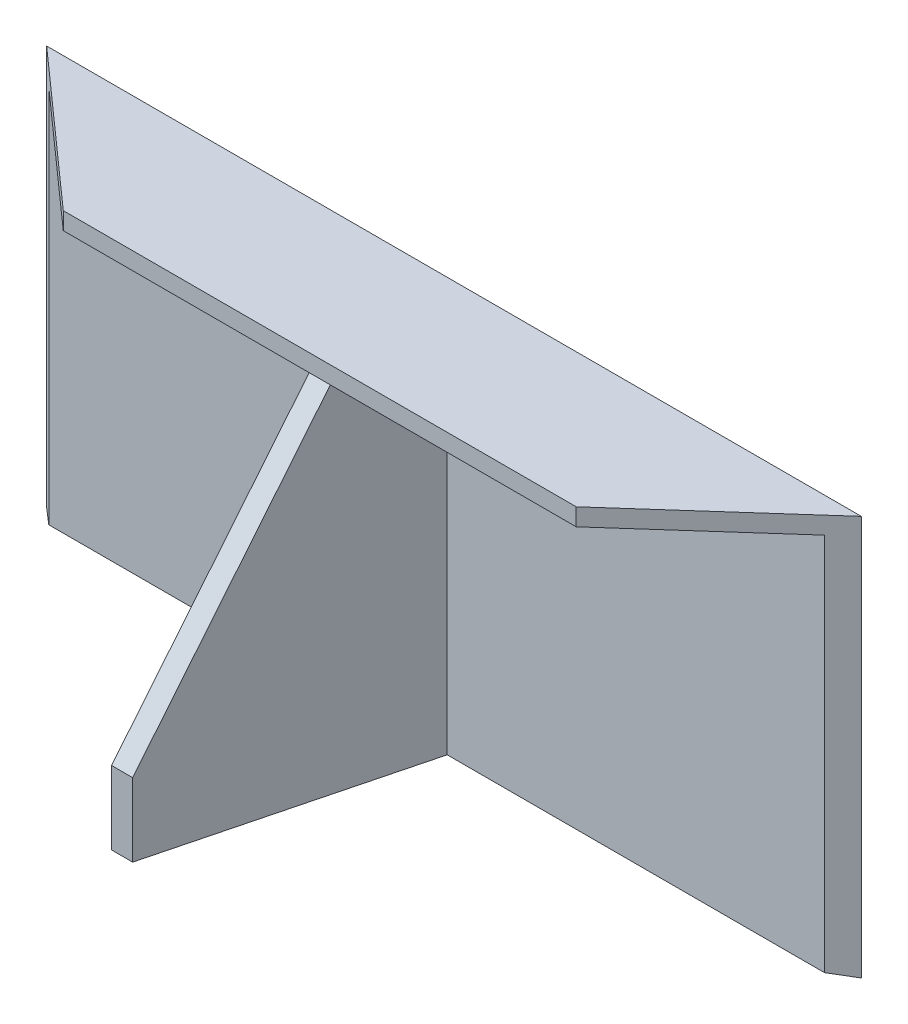
ISO-10303-21;
HEADER;
FILE_DESCRIPTION(('STEP AP214'),'2;1');
FILE_NAME('part.step','',(''),(''),'','','');
FILE_SCHEMA(('AUTOMOTIVE_DESIGN { 1 0 10303 214 1 1 1 1 }'));
ENDSEC;
DATA;
#1=APPLICATION_CONTEXT('core data for automotive mechanical design processes');
#2=APPLICATION_PROTOCOL_DEFINITION('international standard','automotive_design',2000,#1);
#3=PRODUCT_CONTEXT('',#1,'mechanical');
#4=PRODUCT('Part','Part','',(#3));
#5=PRODUCT_RELATED_PRODUCT_CATEGORY('part','',(#4));
#6=PRODUCT_DEFINITION_FORMATION('','',#4);
#7=PRODUCT_DEFINITION_CONTEXT('part definition',#1,'design');
#8=PRODUCT_DEFINITION('design','',#6,#7);
#9=PRODUCT_DEFINITION_SHAPE('','',#8);
#10=(LENGTH_UNIT() NAMED_UNIT(*) SI_UNIT(.MILLI.,.METRE.));
#11=(NAMED_UNIT(*) PLANE_ANGLE_UNIT() SI_UNIT($,.RADIAN.));
#12=(NAMED_UNIT(*) SI_UNIT($,.STERADIAN.) SOLID_ANGLE_UNIT());
#13=UNCERTAINTY_MEASURE_WITH_UNIT(LENGTH_MEASURE(1.E-05),#10,'distance_accuracy_value','');
#14=(GEOMETRIC_REPRESENTATION_CONTEXT(3) GLOBAL_UNCERTAINTY_ASSIGNED_CONTEXT((#13)) GLOBAL_UNIT_ASSIGNED_CONTEXT((#10,
#11,#12)) REPRESENTATION_CONTEXT('',''));
#15=CARTESIAN_POINT('',(0.,0.,0.));
#16=DIRECTION('',(0.,0.,1.));
#17=DIRECTION('',(1.,0.,0.));
#18=AXIS2_PLACEMENT_3D('',#15,#16,#17);
#19=CARTESIAN_POINT('',(0.,265.,11.5));
#20=DIRECTION('',(0.,0.,-1.));
#21=DIRECTION('',(-1.,0.,0.));
#22=AXIS2_PLACEMENT_3D('',#19,#20,#21);
#23=PLANE('',#22);
#24=DIRECTION('',(0.,-1.,0.));
#25=VECTOR('',#24,1.);
#26=CARTESIAN_POINT('',(12.9213483146067,265.,11.5));
#27=LINE('',#26,#25);
#28=CARTESIAN_POINT('',(12.9213483146067,253.5,11.5));
#29=VERTEX_POINT('',#28);
#30=CARTESIAN_POINT('',(12.9213483146067,2.35227272727279,11.5));
#31=VERTEX_POINT('',#30);
#32=EDGE_CURVE('E162',#29,#31,#27,.T.);
#33=ORIENTED_EDGE('',*,*,#32,.T.);
#34=DIRECTION('',(1.,0.,0.));
#35=VECTOR('',#34,1.);
#36=CARTESIAN_POINT('',(0.,2.35227272727279,11.5));
#37=LINE('',#36,#35);
#38=CARTESIAN_POINT('',(263.,2.35227272727273,11.5));
#39=VERTEX_POINT('',#38);
#40=EDGE_CURVE('E223',#31,#39,#37,.T.);
#41=ORIENTED_EDGE('',*,*,#40,.T.);
#42=DIRECTION('',(0.,-1.,0.));
#43=VECTOR('',#42,1.);
#44=CARTESIAN_POINT('',(263.,253.5,11.5));
#45=LINE('',#44,#43);
#46=CARTESIAN_POINT('',(263.,253.5,11.5));
#47=VERTEX_POINT('',#46);
#48=EDGE_CURVE('E208',#47,#39,#45,.T.);
#49=ORIENTED_EDGE('',*,*,#48,.F.);
#50=DIRECTION('',(1.,0.,0.));
#51=VECTOR('',#50,1.);
#52=CARTESIAN_POINT('',(0.,253.5,11.5));
#53=LINE('',#52,#51);
#54=EDGE_CURVE('E149',#29,#47,#53,.T.);
#55=ORIENTED_EDGE('',*,*,#54,.F.);
#56=EDGE_LOOP('',(#33,#41,#49,#55));
#57=FACE_BOUND('',#56,.T.);
#58=ADVANCED_FACE('F34',(#57),#23,.F.);
#59=DIRECTION('',(0.,1.,0.));
#60=VECTOR('',#59,1.);
#61=CARTESIAN_POINT('',(277.,253.5,11.5));
#62=LINE('',#61,#60);
#63=CARTESIAN_POINT('',(277.,2.35227272727274,11.5000000000001));
#64=VERTEX_POINT('',#63);
#65=CARTESIAN_POINT('',(277.,253.5,11.5));
#66=VERTEX_POINT('',#65);
#67=EDGE_CURVE('E217',#64,#66,#62,.T.);
#68=ORIENTED_EDGE('',*,*,#67,.F.);
#69=DIRECTION('',(-1.,0.,0.));
#70=VECTOR('',#69,1.);
#71=CARTESIAN_POINT('',(540.,2.35227272727274,11.5000000000001));
#72=LINE('',#71,#70);
#73=CARTESIAN_POINT('',(527.078651685393,2.35227272727274,11.5000000000001));
#74=VERTEX_POINT('',#73);
#75=EDGE_CURVE('E135',#74,#64,#72,.T.);
#76=ORIENTED_EDGE('',*,*,#75,.F.);
#77=DIRECTION('',(0.,1.,0.));
#78=VECTOR('',#77,1.);
#79=CARTESIAN_POINT('',(527.078651685393,265.,11.5));
#80=LINE('',#79,#78);
#81=CARTESIAN_POINT('',(527.078651685393,253.5,11.5));
#82=VERTEX_POINT('',#81);
#83=EDGE_CURVE('E134',#74,#82,#80,.T.);
#84=ORIENTED_EDGE('',*,*,#83,.T.);
#85=EDGE_CURVE('E154',#66,#82,#53,.T.);
#86=ORIENTED_EDGE('',*,*,#85,.F.);
#87=EDGE_LOOP('',(#68,#76,#84,#86));
#88=FACE_BOUND('',#87,.T.);
#89=ADVANCED_FACE('F234',(#88),#23,.F.);
#90=CARTESIAN_POINT('',(0.,253.5,89.));
#91=DIRECTION('',(0.,1.,0.));
#92=DIRECTION('',(0.,0.,1.));
#93=AXIS2_PLACEMENT_3D('',#90,#91,#92);
#94=PLANE('',#93);
#95=DIRECTION('',(0.,0.,-1.));
#96=VECTOR('',#95,1.);
#97=CARTESIAN_POINT('',(263.,253.5,220.));
#98=LINE('',#97,#96);
#99=CARTESIAN_POINT('',(263.,253.5,89.));
#100=VERTEX_POINT('',#99);
#101=EDGE_CURVE('E203',#100,#47,#98,.T.);
#102=ORIENTED_EDGE('',*,*,#101,.F.);
#103=DIRECTION('',(1.,0.,0.));
#104=VECTOR('',#103,1.);
#105=CARTESIAN_POINT('',(0.,253.5,89.));
#106=LINE('',#105,#104);
#107=CARTESIAN_POINT('',(100.,253.5,89.));
#108=VERTEX_POINT('',#107);
#109=EDGE_CURVE('E189',#108,#100,#106,.T.);
#110=ORIENTED_EDGE('',*,*,#109,.F.);
#111=DIRECTION('',(-0.746997038573461,0.,-0.66482736433038));
#112=VECTOR('',#111,1.);
#113=CARTESIAN_POINT('',(44.199542436248,253.5,39.3375927682607));
#114=LINE('',#113,#112);
#115=EDGE_CURVE('E185',#108,#29,#114,.T.);
#116=ORIENTED_EDGE('',*,*,#115,.T.);
#117=ORIENTED_EDGE('',*,*,#54,.T.);
#118=EDGE_LOOP('',(#102,#110,#116,#117));
#119=FACE_BOUND('',#118,.T.);
#120=ADVANCED_FACE('F211',(#119),#94,.F.);
#121=DIRECTION('',(0.,0.,-1.));
#122=VECTOR('',#121,1.);
#123=CARTESIAN_POINT('',(277.,253.5,220.));
#124=LINE('',#123,#122);
#125=CARTESIAN_POINT('',(277.,253.5,89.));
#126=VERTEX_POINT('',#125);
#127=EDGE_CURVE('E180',#126,#66,#124,.T.);
#128=ORIENTED_EDGE('',*,*,#127,.T.);
#129=ORIENTED_EDGE('',*,*,#85,.T.);
#130=DIRECTION('',(-0.746997038573461,0.,0.66482736433038));
#131=VECTOR('',#130,1.);
#132=CARTESIAN_POINT('',(194.477986719491,253.5,307.514591819653));
#133=LINE('',#132,#131);
#134=CARTESIAN_POINT('',(440.,253.5,89.));
#135=VERTEX_POINT('',#134);
#136=EDGE_CURVE('E167',#82,#135,#133,.T.);
#137=ORIENTED_EDGE('',*,*,#136,.T.);
#138=EDGE_CURVE('E153',#126,#135,#106,.T.);
#139=ORIENTED_EDGE('',*,*,#138,.F.);
#140=EDGE_LOOP('',(#128,#129,#137,#139));
#141=FACE_BOUND('',#140,.T.);
#142=ADVANCED_FACE('F174',(#141),#94,.F.);
#143=CARTESIAN_POINT('',(0.,265.,11.5));
#144=DIRECTION('',(0.,-1.,0.));
#145=DIRECTION('',(0.,0.,-1.));
#146=AXIS2_PLACEMENT_3D('',#143,#144,#145);
#147=PLANE('',#146);
#148=DIRECTION('',(-1.,0.,0.));
#149=VECTOR('',#148,1.);
#150=CARTESIAN_POINT('',(0.,265.,89.));
#151=LINE('',#150,#149);
#152=CARTESIAN_POINT('',(440.,265.,89.));
#153=VERTEX_POINT('',#152);
#154=CARTESIAN_POINT('',(100.,265.,89.));
#155=VERTEX_POINT('',#154);
#156=EDGE_CURVE('E158',#153,#155,#151,.T.);
#157=ORIENTED_EDGE('',*,*,#156,.F.);
#158=DIRECTION('',(-0.746997038573461,0.,0.66482736433038));
#159=VECTOR('',#158,1.);
#160=CARTESIAN_POINT('',(540.,265.,0.));
#161=LINE('',#160,#159);
#162=CARTESIAN_POINT('',(540.,265.,0.));
#163=VERTEX_POINT('',#162);
#164=EDGE_CURVE('E168',#163,#153,#161,.T.);
#165=ORIENTED_EDGE('',*,*,#164,.F.);
#166=DIRECTION('',(-1.,0.,0.));
#167=VECTOR('',#166,1.);
#168=CARTESIAN_POINT('',(0.,265.,0.));
#169=LINE('',#168,#167);
#170=CARTESIAN_POINT('',(0.,265.,0.));
#171=VERTEX_POINT('',#170);
#172=EDGE_CURVE('E140',#163,#171,#169,.T.);
#173=ORIENTED_EDGE('',*,*,#172,.T.);
#174=DIRECTION('',(-0.746997038573461,0.,-0.66482736433038));
#175=VECTOR('',#174,1.);
#176=CARTESIAN_POINT('',(0.,265.,0.));
#177=LINE('',#176,#175);
#178=EDGE_CURVE('E178',#155,#171,#177,.T.);
#179=ORIENTED_EDGE('',*,*,#178,.F.);
#180=EDGE_LOOP('',(#157,#165,#173,#179));
#181=FACE_BOUND('',#180,.T.);
#182=ADVANCED_FACE('F36',(#181),#147,.F.);
#183=CARTESIAN_POINT('',(0.,265.,0.));
#184=DIRECTION('',(0.,0.,-1.));
#185=DIRECTION('',(-1.,0.,0.));
#186=AXIS2_PLACEMENT_3D('',#183,#184,#185);
#187=PLANE('',#186);
#188=DIRECTION('',(0.,-1.,0.));
#189=VECTOR('',#188,1.);
#190=CARTESIAN_POINT('',(0.,0.,0.));
#191=LINE('',#190,#189);
#192=CARTESIAN_POINT('',(0.,0.,0.));
#193=VERTEX_POINT('',#192);
#194=EDGE_CURVE('E127',#171,#193,#191,.T.);
#195=ORIENTED_EDGE('',*,*,#194,.F.);
#196=ORIENTED_EDGE('',*,*,#172,.F.);
#197=DIRECTION('',(0.,1.,0.));
#198=VECTOR('',#197,1.);
#199=CARTESIAN_POINT('',(540.,0.,0.));
#200=LINE('',#199,#198);
#201=CARTESIAN_POINT('',(540.,0.,0.));
#202=VERTEX_POINT('',#201);
#203=EDGE_CURVE('E126',#202,#163,#200,.T.);
#204=ORIENTED_EDGE('',*,*,#203,.F.);
#205=DIRECTION('',(1.,0.,0.));
#206=VECTOR('',#205,1.);
#207=CARTESIAN_POINT('',(0.,0.,0.));
#208=LINE('',#207,#206);
#209=EDGE_CURVE('E115',#193,#202,#208,.T.);
#210=ORIENTED_EDGE('',*,*,#209,.F.);
#211=EDGE_LOOP('',(#195,#196,#204,#210));
#212=FACE_BOUND('',#211,.T.);
#213=ADVANCED_FACE('F138',(#212),#187,.T.);
#214=CARTESIAN_POINT('',(0.,253.5,89.));
#215=DIRECTION('',(0.,0.,1.));
#216=DIRECTION('',(1.,0.,0.));
#217=AXIS2_PLACEMENT_3D('',#214,#215,#216);
#218=PLANE('',#217);
#219=DIRECTION('',(0.,-1.,0.));
#220=VECTOR('',#219,1.);
#221=CARTESIAN_POINT('',(440.,253.5,89.));
#222=LINE('',#221,#220);
#223=EDGE_CURVE('E148',#153,#135,#222,.T.);
#224=ORIENTED_EDGE('',*,*,#223,.F.);
#225=ORIENTED_EDGE('',*,*,#156,.T.);
#226=DIRECTION('',(0.,1.,0.));
#227=VECTOR('',#226,1.);
#228=CARTESIAN_POINT('',(100.,253.5,89.));
#229=LINE('',#228,#227);
#230=EDGE_CURVE('E142',#108,#155,#229,.T.);
#231=ORIENTED_EDGE('',*,*,#230,.F.);
#232=ORIENTED_EDGE('',*,*,#109,.T.);
#233=EDGE_CURVE('E191',#100,#126,#106,.T.);
#234=ORIENTED_EDGE('',*,*,#233,.T.);
#235=ORIENTED_EDGE('',*,*,#138,.T.);
#236=EDGE_LOOP('',(#224,#225,#231,#232,#234,#235));
#237=FACE_BOUND('',#236,.T.);
#238=ADVANCED_FACE('F194',(#237),#218,.T.);
#239=CARTESIAN_POINT('',(0.,-2.50000000145967E-05,0.));
#240=DIRECTION('',(0.66482736433038,0.,-0.746997038573461));
#241=DIRECTION('',(-0.746997038573461,0.,-0.66482736433038));
#242=AXIS2_PLACEMENT_3D('',#239,#240,#241);
#243=PLANE('',#242);
#244=ORIENTED_EDGE('',*,*,#194,.T.);
#245=DIRECTION('',(0.740184431111828,0.134747211209222,0.658764143689527));
#246=VECTOR('',#245,1.);
#247=CARTESIAN_POINT('',(-2.49344469740945E-06,-4.53920282011262E-07,-2.21916578069441E-06));
#248=LINE('',#247,#246);
#249=EDGE_CURVE('E121',#193,#31,#248,.T.);
#250=ORIENTED_EDGE('',*,*,#249,.T.);
#251=ORIENTED_EDGE('',*,*,#32,.F.);
#252=ORIENTED_EDGE('',*,*,#115,.F.);
#253=ORIENTED_EDGE('',*,*,#230,.T.);
#254=ORIENTED_EDGE('',*,*,#178,.T.);
#255=EDGE_LOOP('',(#244,#250,#251,#252,#253,#254));
#256=FACE_BOUND('',#255,.T.);
#257=ADVANCED_FACE('F249',(#256),#243,.F.);
#258=CARTESIAN_POINT('',(540.,-2.50000000145967E-05,0.));
#259=DIRECTION('',(-0.66482736433038,0.,-0.746997038573461));
#260=DIRECTION('',(-0.746997038573461,0.,0.66482736433038));
#261=AXIS2_PLACEMENT_3D('',#258,#259,#260);
#262=PLANE('',#261);
#263=ORIENTED_EDGE('',*,*,#83,.F.);
#264=DIRECTION('',(0.740184431111828,-0.134747211209221,-0.658764143689527));
#265=VECTOR('',#264,1.);
#266=CARTESIAN_POINT('',(540.000002493445,-4.53920273481593E-07,-2.21916578146556E-06));
#267=LINE('',#266,#265);
#268=EDGE_CURVE('E118',#74,#202,#267,.T.);
#269=ORIENTED_EDGE('',*,*,#268,.T.);
#270=ORIENTED_EDGE('',*,*,#203,.T.);
#271=ORIENTED_EDGE('',*,*,#164,.T.);
#272=ORIENTED_EDGE('',*,*,#223,.T.);
#273=ORIENTED_EDGE('',*,*,#136,.F.);
#274=EDGE_LOOP('',(#263,#269,#270,#271,#272,#273));
#275=FACE_BOUND('',#274,.T.);
#276=ADVANCED_FACE('F131',(#275),#262,.F.);
#277=CARTESIAN_POINT('',(263.,253.5,220.));
#278=DIRECTION('',(1.,0.,0.));
#279=DIRECTION('',(0.,1.,0.));
#280=AXIS2_PLACEMENT_3D('',#277,#278,#279);
#281=PLANE('',#280);
#282=ORIENTED_EDGE('',*,*,#48,.T.);
#283=DIRECTION('',(0.,0.200396236148707,0.979714932282566));
#284=VECTOR('',#283,1.);
#285=CARTESIAN_POINT('',(263.,53.3730788299455,260.935052057511));
#286=LINE('',#285,#284);
#287=CARTESIAN_POINT('',(263.,45.,220.));
#288=VERTEX_POINT('',#287);
#289=EDGE_CURVE('E226',#39,#288,#286,.T.);
#290=ORIENTED_EDGE('',*,*,#289,.T.);
#291=DIRECTION('',(0.,-1.,0.));
#292=VECTOR('',#291,1.);
#293=CARTESIAN_POINT('',(263.,253.5,220.));
#294=LINE('',#293,#292);
#295=CARTESIAN_POINT('',(263.,93.5,220.));
#296=VERTEX_POINT('',#295);
#297=EDGE_CURVE('E207',#296,#288,#294,.T.);
#298=ORIENTED_EDGE('',*,*,#297,.F.);
#299=DIRECTION('',(0.,0.773741794125483,-0.633501093940239));
#300=VECTOR('',#299,1.);
#301=CARTESIAN_POINT('',(263.,189.288218236243,141.573396319076));
#302=LINE('',#301,#300);
#303=EDGE_CURVE('E56',#296,#100,#302,.T.);
#304=ORIENTED_EDGE('',*,*,#303,.T.);
#305=ORIENTED_EDGE('',*,*,#101,.T.);
#306=EDGE_LOOP('',(#282,#290,#298,#304,#305));
#307=FACE_BOUND('',#306,.T.);
#308=ADVANCED_FACE('F202',(#307),#281,.F.);
#309=CARTESIAN_POINT('',(277.,253.5,220.));
#310=DIRECTION('',(-1.,0.,0.));
#311=DIRECTION('',(0.,0.,1.));
#312=AXIS2_PLACEMENT_3D('',#309,#310,#311);
#313=PLANE('',#312);
#314=DIRECTION('',(0.,1.,0.));
#315=VECTOR('',#314,1.);
#316=CARTESIAN_POINT('',(277.,253.5,220.));
#317=LINE('',#316,#315);
#318=CARTESIAN_POINT('',(277.,45.,220.));
#319=VERTEX_POINT('',#318);
#320=CARTESIAN_POINT('',(277.,93.5,220.));
#321=VERTEX_POINT('',#320);
#322=EDGE_CURVE('E213',#319,#321,#317,.T.);
#323=ORIENTED_EDGE('',*,*,#322,.F.);
#324=DIRECTION('',(0.,0.200396236148707,0.979714932282565));
#325=VECTOR('',#324,1.);
#326=CARTESIAN_POINT('',(277.,45.,220.));
#327=LINE('',#326,#325);
#328=EDGE_CURVE('E48',#64,#319,#327,.T.);
#329=ORIENTED_EDGE('',*,*,#328,.F.);
#330=ORIENTED_EDGE('',*,*,#67,.T.);
#331=ORIENTED_EDGE('',*,*,#127,.F.);
#332=DIRECTION('',(0.,0.773741794125482,-0.633501093940239));
#333=VECTOR('',#332,1.);
#334=CARTESIAN_POINT('',(277.,253.5,89.));
#335=LINE('',#334,#333);
#336=EDGE_CURVE('E196',#321,#126,#335,.T.);
#337=ORIENTED_EDGE('',*,*,#336,.F.);
#338=EDGE_LOOP('',(#323,#329,#330,#331,#337));
#339=FACE_BOUND('',#338,.T.);
#340=ADVANCED_FACE('F233',(#339),#313,.F.);
#341=CARTESIAN_POINT('',(263.,0.,220.));
#342=DIRECTION('',(0.,0.,1.));
#343=DIRECTION('',(1.,0.,0.));
#344=AXIS2_PLACEMENT_3D('',#341,#342,#343);
#345=PLANE('',#344);
#346=DIRECTION('',(-1.,0.,0.));
#347=VECTOR('',#346,1.);
#348=CARTESIAN_POINT('',(263.,45.,220.));
#349=LINE('',#348,#347);
#350=EDGE_CURVE('E11',#319,#288,#349,.T.);
#351=ORIENTED_EDGE('',*,*,#350,.F.);
#352=ORIENTED_EDGE('',*,*,#322,.T.);
#353=DIRECTION('',(1.,0.,0.));
#354=VECTOR('',#353,1.);
#355=CARTESIAN_POINT('',(263.,93.5,220.));
#356=LINE('',#355,#354);
#357=EDGE_CURVE('E42',#296,#321,#356,.T.);
#358=ORIENTED_EDGE('',*,*,#357,.F.);
#359=ORIENTED_EDGE('',*,*,#297,.T.);
#360=EDGE_LOOP('',(#351,#352,#358,#359));
#361=FACE_BOUND('',#360,.T.);
#362=ADVANCED_FACE('F257',(#361),#345,.T.);
#363=CARTESIAN_POINT('',(0.,253.5,89.));
#364=DIRECTION('',(0.,-0.633501093940239,-0.773741794125482));
#365=DIRECTION('',(0.,0.773741794125483,-0.633501093940239));
#366=AXIS2_PLACEMENT_3D('',#363,#364,#365);
#367=PLANE('',#366);
#368=ORIENTED_EDGE('',*,*,#357,.T.);
#369=ORIENTED_EDGE('',*,*,#336,.T.);
#370=ORIENTED_EDGE('',*,*,#233,.F.);
#371=ORIENTED_EDGE('',*,*,#303,.F.);
#372=EDGE_LOOP('',(#368,#369,#370,#371));
#373=FACE_BOUND('',#372,.T.);
#374=ADVANCED_FACE('F195',(#373),#367,.F.);
#375=CARTESIAN_POINT('',(0.,45.,220.));
#376=DIRECTION('',(0.,0.979714932282566,-0.200396236148707));
#377=DIRECTION('',(0.,0.200396236148707,0.979714932282566));
#378=AXIS2_PLACEMENT_3D('',#375,#376,#377);
#379=PLANE('',#378);
#380=ORIENTED_EDGE('',*,*,#209,.T.);
#381=ORIENTED_EDGE('',*,*,#268,.F.);
#382=ORIENTED_EDGE('',*,*,#75,.T.);
#383=ORIENTED_EDGE('',*,*,#328,.T.);
#384=ORIENTED_EDGE('',*,*,#350,.T.);
#385=ORIENTED_EDGE('',*,*,#289,.F.);
#386=ORIENTED_EDGE('',*,*,#40,.F.);
#387=ORIENTED_EDGE('',*,*,#249,.F.);
#388=EDGE_LOOP('',(#380,#381,#382,#383,#384,#385,#386,#387));
#389=FACE_BOUND('',#388,.T.);
#390=ADVANCED_FACE('F117',(#389),#379,.F.);
#391=CLOSED_SHELL('',(#58,#89,#120,#142,#182,#213,#238,#257,#276,#308,#340,#362,#374,#390));
#392=MANIFOLD_SOLID_BREP('B2',#391);
#393=ADVANCED_BREP_SHAPE_REPRESENTATION('',(#18,#392),#14);
#394=SHAPE_DEFINITION_REPRESENTATION(#9,#393);
ENDSEC;
END-ISO-10303-21;
